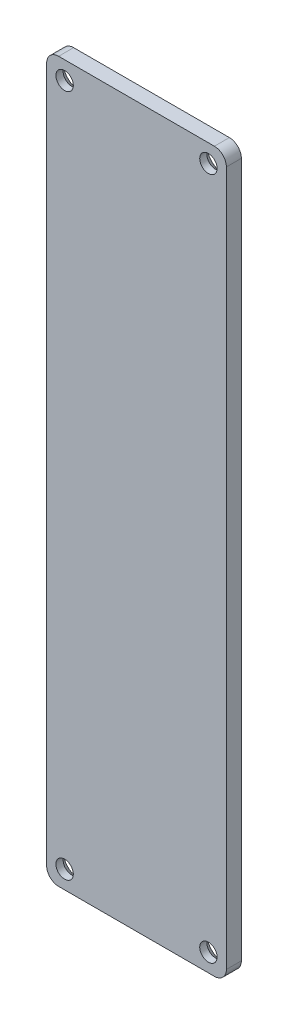
ISO-10303-21;
HEADER;
FILE_DESCRIPTION(('STEP AP214'),'2;1');
FILE_NAME('part.step','',(''),(''),'','','');
FILE_SCHEMA(('AUTOMOTIVE_DESIGN { 1 0 10303 214 1 1 1 1 }'));
ENDSEC;
DATA;
#1=APPLICATION_CONTEXT('core data for automotive mechanical design processes');
#2=APPLICATION_PROTOCOL_DEFINITION('international standard','automotive_design',2000,#1);
#3=PRODUCT_CONTEXT('',#1,'mechanical');
#4=PRODUCT('Part','Part','',(#3));
#5=PRODUCT_RELATED_PRODUCT_CATEGORY('part','',(#4));
#6=PRODUCT_DEFINITION_FORMATION('','',#4);
#7=PRODUCT_DEFINITION_CONTEXT('part definition',#1,'design');
#8=PRODUCT_DEFINITION('design','',#6,#7);
#9=PRODUCT_DEFINITION_SHAPE('','',#8);
#10=(LENGTH_UNIT() NAMED_UNIT(*) SI_UNIT(.MILLI.,.METRE.));
#11=(NAMED_UNIT(*) PLANE_ANGLE_UNIT() SI_UNIT($,.RADIAN.));
#12=(NAMED_UNIT(*) SI_UNIT($,.STERADIAN.) SOLID_ANGLE_UNIT());
#13=UNCERTAINTY_MEASURE_WITH_UNIT(LENGTH_MEASURE(1.E-05),#10,'distance_accuracy_value','');
#14=(GEOMETRIC_REPRESENTATION_CONTEXT(3) GLOBAL_UNCERTAINTY_ASSIGNED_CONTEXT((#13)) GLOBAL_UNIT_ASSIGNED_CONTEXT((#10,
#11,#12)) REPRESENTATION_CONTEXT('',''));
#15=CARTESIAN_POINT('',(0.,0.,0.));
#16=DIRECTION('',(0.,0.,1.));
#17=DIRECTION('',(1.,0.,0.));
#18=AXIS2_PLACEMENT_3D('',#15,#16,#17);
#19=CARTESIAN_POINT('',(-91.1225727439967,-25.5678939773836,2.5));
#20=DIRECTION('',(0.,0.,-1.));
#21=DIRECTION('',(-1.,0.,0.));
#22=AXIS2_PLACEMENT_3D('',#19,#20,#21);
#23=CYLINDRICAL_SURFACE('',#22,1.99999999999999);
#24=CARTESIAN_POINT('',(-91.1225727439967,-25.5678939773836,0.));
#25=DIRECTION('',(0.,0.,1.));
#26=DIRECTION('',(-1.,0.,0.));
#27=AXIS2_PLACEMENT_3D('',#24,#25,#26);
#28=CIRCLE('',#27,1.99999999999999);
#29=CARTESIAN_POINT('',(-93.1225727439967,-25.5678939773836,0.));
#30=VERTEX_POINT('',#29);
#31=CARTESIAN_POINT('',(-91.1225727439967,-27.5678939773836,0.));
#32=VERTEX_POINT('',#31);
#33=EDGE_CURVE('E135',#30,#32,#28,.T.);
#34=ORIENTED_EDGE('',*,*,#33,.T.);
#35=DIRECTION('',(0.,0.,-1.));
#36=VECTOR('',#35,1.);
#37=CARTESIAN_POINT('',(-91.1225727439967,-27.5678939773836,2.5));
#38=LINE('',#37,#36);
#39=CARTESIAN_POINT('',(-91.1225727439967,-27.5678939773836,2.5));
#40=VERTEX_POINT('',#39);
#41=EDGE_CURVE('E11',#40,#32,#38,.T.);
#42=ORIENTED_EDGE('',*,*,#41,.F.);
#43=CARTESIAN_POINT('',(-91.1225727439967,-25.5678939773836,2.5));
#44=DIRECTION('',(0.,0.,1.));
#45=DIRECTION('',(-1.,0.,0.));
#46=AXIS2_PLACEMENT_3D('',#43,#44,#45);
#47=CIRCLE('',#46,1.99999999999999);
#48=CARTESIAN_POINT('',(-93.1225727439967,-25.5678939773836,2.5));
#49=VERTEX_POINT('',#48);
#50=EDGE_CURVE('E150',#49,#40,#47,.T.);
#51=ORIENTED_EDGE('',*,*,#50,.F.);
#52=DIRECTION('',(0.,0.,-1.));
#53=VECTOR('',#52,1.);
#54=CARTESIAN_POINT('',(-93.1225727439967,-25.5678939773836,2.5));
#55=LINE('',#54,#53);
#56=EDGE_CURVE('E131',#49,#30,#55,.T.);
#57=ORIENTED_EDGE('',*,*,#56,.T.);
#58=EDGE_LOOP('',(#34,#42,#51,#57));
#59=FACE_BOUND('',#58,.T.);
#60=ADVANCED_FACE('F39',(#59),#23,.T.);
#61=CARTESIAN_POINT('',(-91.1225727439967,-27.5678939773836,2.5));
#62=DIRECTION('',(0.,1.,0.));
#63=DIRECTION('',(-1.,0.,0.));
#64=AXIS2_PLACEMENT_3D('',#61,#62,#63);
#65=PLANE('',#64);
#66=DIRECTION('',(1.,0.,0.));
#67=VECTOR('',#66,1.);
#68=CARTESIAN_POINT('',(-91.1225727439967,-27.5678939773836,0.));
#69=LINE('',#68,#67);
#70=CARTESIAN_POINT('',(-65.1225727439967,-27.5678939773836,0.));
#71=VERTEX_POINT('',#70);
#72=EDGE_CURVE('E138',#32,#71,#69,.T.);
#73=ORIENTED_EDGE('',*,*,#72,.T.);
#74=DIRECTION('',(0.,0.,-1.));
#75=VECTOR('',#74,1.);
#76=CARTESIAN_POINT('',(-65.1225727439967,-27.5678939773836,2.5));
#77=LINE('',#76,#75);
#78=CARTESIAN_POINT('',(-65.1225727439967,-27.5678939773836,2.5));
#79=VERTEX_POINT('',#78);
#80=EDGE_CURVE('E47',#79,#71,#77,.T.);
#81=ORIENTED_EDGE('',*,*,#80,.F.);
#82=DIRECTION('',(1.,0.,0.));
#83=VECTOR('',#82,1.);
#84=CARTESIAN_POINT('',(-91.1225727439967,-27.5678939773836,2.5));
#85=LINE('',#84,#83);
#86=EDGE_CURVE('E98',#40,#79,#85,.T.);
#87=ORIENTED_EDGE('',*,*,#86,.F.);
#88=ORIENTED_EDGE('',*,*,#41,.T.);
#89=EDGE_LOOP('',(#73,#81,#87,#88));
#90=FACE_BOUND('',#89,.T.);
#91=ADVANCED_FACE('F247',(#90),#65,.F.);
#92=CARTESIAN_POINT('',(-65.1225727439967,-25.5678939773836,2.5));
#93=DIRECTION('',(0.,0.,-1.));
#94=DIRECTION('',(-1.,0.,0.));
#95=AXIS2_PLACEMENT_3D('',#92,#93,#94);
#96=CYLINDRICAL_SURFACE('',#95,2.);
#97=CARTESIAN_POINT('',(-65.1225727439967,-25.5678939773836,0.));
#98=DIRECTION('',(0.,0.,1.));
#99=DIRECTION('',(1.,0.,0.));
#100=AXIS2_PLACEMENT_3D('',#97,#98,#99);
#101=CIRCLE('',#100,2.);
#102=CARTESIAN_POINT('',(-63.1225727439967,-25.5678939773836,0.));
#103=VERTEX_POINT('',#102);
#104=EDGE_CURVE('E141',#71,#103,#101,.T.);
#105=ORIENTED_EDGE('',*,*,#104,.T.);
#106=DIRECTION('',(0.,0.,-1.));
#107=VECTOR('',#106,1.);
#108=CARTESIAN_POINT('',(-63.1225727439967,-25.5678939773836,2.5));
#109=LINE('',#108,#107);
#110=CARTESIAN_POINT('',(-63.1225727439967,-25.5678939773836,2.5));
#111=VERTEX_POINT('',#110);
#112=EDGE_CURVE('E157',#111,#103,#109,.T.);
#113=ORIENTED_EDGE('',*,*,#112,.F.);
#114=CARTESIAN_POINT('',(-65.1225727439967,-25.5678939773836,2.5));
#115=DIRECTION('',(0.,0.,1.));
#116=DIRECTION('',(1.,0.,0.));
#117=AXIS2_PLACEMENT_3D('',#114,#115,#116);
#118=CIRCLE('',#117,2.);
#119=EDGE_CURVE('E165',#79,#111,#118,.T.);
#120=ORIENTED_EDGE('',*,*,#119,.F.);
#121=ORIENTED_EDGE('',*,*,#80,.T.);
#122=EDGE_LOOP('',(#105,#113,#120,#121));
#123=FACE_BOUND('',#122,.T.);
#124=ADVANCED_FACE('F163',(#123),#96,.T.);
#125=CARTESIAN_POINT('',(-63.1225727439967,90.4321060226164,2.5));
#126=DIRECTION('',(-1.,0.,0.));
#127=DIRECTION('',(0.,-1.,0.));
#128=AXIS2_PLACEMENT_3D('',#125,#126,#127);
#129=PLANE('',#128);
#130=DIRECTION('',(0.,1.,0.));
#131=VECTOR('',#130,1.);
#132=CARTESIAN_POINT('',(-63.1225727439967,90.4321060226164,0.));
#133=LINE('',#132,#131);
#134=CARTESIAN_POINT('',(-63.1225727439967,90.4321060226164,0.));
#135=VERTEX_POINT('',#134);
#136=EDGE_CURVE('E143',#103,#135,#133,.T.);
#137=ORIENTED_EDGE('',*,*,#136,.T.);
#138=DIRECTION('',(0.,0.,-1.));
#139=VECTOR('',#138,1.);
#140=CARTESIAN_POINT('',(-63.1225727439967,90.4321060226164,2.5));
#141=LINE('',#140,#139);
#142=CARTESIAN_POINT('',(-63.1225727439967,90.4321060226164,2.5));
#143=VERTEX_POINT('',#142);
#144=EDGE_CURVE('E154',#143,#135,#141,.T.);
#145=ORIENTED_EDGE('',*,*,#144,.F.);
#146=DIRECTION('',(0.,1.,0.));
#147=VECTOR('',#146,1.);
#148=CARTESIAN_POINT('',(-63.1225727439967,90.4321060226164,2.5));
#149=LINE('',#148,#147);
#150=EDGE_CURVE('E177',#111,#143,#149,.T.);
#151=ORIENTED_EDGE('',*,*,#150,.F.);
#152=ORIENTED_EDGE('',*,*,#112,.T.);
#153=EDGE_LOOP('',(#137,#145,#151,#152));
#154=FACE_BOUND('',#153,.T.);
#155=ADVANCED_FACE('F173',(#154),#129,.F.);
#156=CARTESIAN_POINT('',(-65.1225727439967,90.4321060226164,2.5));
#157=DIRECTION('',(0.,0.,-1.));
#158=DIRECTION('',(-1.,0.,0.));
#159=AXIS2_PLACEMENT_3D('',#156,#157,#158);
#160=CYLINDRICAL_SURFACE('',#159,2.);
#161=CARTESIAN_POINT('',(-65.1225727439967,90.4321060226164,0.));
#162=DIRECTION('',(0.,0.,1.));
#163=DIRECTION('',(-1.,0.,0.));
#164=AXIS2_PLACEMENT_3D('',#161,#162,#163);
#165=CIRCLE('',#164,2.);
#166=CARTESIAN_POINT('',(-65.1225727439967,92.4321060226164,0.));
#167=VERTEX_POINT('',#166);
#168=EDGE_CURVE('E145',#135,#167,#165,.T.);
#169=ORIENTED_EDGE('',*,*,#168,.T.);
#170=DIRECTION('',(0.,0.,-1.));
#171=VECTOR('',#170,1.);
#172=CARTESIAN_POINT('',(-65.1225727439967,92.4321060226164,2.5));
#173=LINE('',#172,#171);
#174=CARTESIAN_POINT('',(-65.1225727439967,92.4321060226164,2.5));
#175=VERTEX_POINT('',#174);
#176=EDGE_CURVE('E126',#175,#167,#173,.T.);
#177=ORIENTED_EDGE('',*,*,#176,.F.);
#178=CARTESIAN_POINT('',(-65.1225727439967,90.4321060226164,2.5));
#179=DIRECTION('',(0.,0.,1.));
#180=DIRECTION('',(-1.,0.,0.));
#181=AXIS2_PLACEMENT_3D('',#178,#179,#180);
#182=CIRCLE('',#181,2.);
#183=EDGE_CURVE('E117',#143,#175,#182,.T.);
#184=ORIENTED_EDGE('',*,*,#183,.F.);
#185=ORIENTED_EDGE('',*,*,#144,.T.);
#186=EDGE_LOOP('',(#169,#177,#184,#185));
#187=FACE_BOUND('',#186,.T.);
#188=ADVANCED_FACE('F176',(#187),#160,.T.);
#189=CARTESIAN_POINT('',(-91.1225727439967,92.4321060226164,2.5));
#190=DIRECTION('',(0.,-1.,0.));
#191=DIRECTION('',(0.,0.,-1.));
#192=AXIS2_PLACEMENT_3D('',#189,#190,#191);
#193=PLANE('',#192);
#194=DIRECTION('',(-1.,0.,0.));
#195=VECTOR('',#194,1.);
#196=CARTESIAN_POINT('',(-91.1225727439967,92.4321060226164,0.));
#197=LINE('',#196,#195);
#198=CARTESIAN_POINT('',(-91.1225727439967,92.4321060226164,0.));
#199=VERTEX_POINT('',#198);
#200=EDGE_CURVE('E125',#167,#199,#197,.T.);
#201=ORIENTED_EDGE('',*,*,#200,.T.);
#202=DIRECTION('',(0.,0.,-1.));
#203=VECTOR('',#202,1.);
#204=CARTESIAN_POINT('',(-91.1225727439967,92.4321060226164,2.5));
#205=LINE('',#204,#203);
#206=CARTESIAN_POINT('',(-91.1225727439967,92.4321060226164,2.5));
#207=VERTEX_POINT('',#206);
#208=EDGE_CURVE('E122',#207,#199,#205,.T.);
#209=ORIENTED_EDGE('',*,*,#208,.F.);
#210=DIRECTION('',(-1.,0.,0.));
#211=VECTOR('',#210,1.);
#212=CARTESIAN_POINT('',(-91.1225727439967,92.4321060226164,2.5));
#213=LINE('',#212,#211);
#214=EDGE_CURVE('E111',#175,#207,#213,.T.);
#215=ORIENTED_EDGE('',*,*,#214,.F.);
#216=ORIENTED_EDGE('',*,*,#176,.T.);
#217=EDGE_LOOP('',(#201,#209,#215,#216));
#218=FACE_BOUND('',#217,.T.);
#219=ADVANCED_FACE('F123',(#218),#193,.F.);
#220=CARTESIAN_POINT('',(-91.1225727439967,90.4321060226164,2.5));
#221=DIRECTION('',(0.,0.,-1.));
#222=DIRECTION('',(-1.,0.,0.));
#223=AXIS2_PLACEMENT_3D('',#220,#221,#222);
#224=CYLINDRICAL_SURFACE('',#223,1.99999999999999);
#225=CARTESIAN_POINT('',(-91.1225727439967,90.4321060226164,0.));
#226=DIRECTION('',(0.,0.,1.));
#227=DIRECTION('',(-1.,0.,0.));
#228=AXIS2_PLACEMENT_3D('',#225,#226,#227);
#229=CIRCLE('',#228,1.99999999999999);
#230=CARTESIAN_POINT('',(-93.1225727439967,90.4321060226164,0.));
#231=VERTEX_POINT('',#230);
#232=EDGE_CURVE('E84',#199,#231,#229,.T.);
#233=ORIENTED_EDGE('',*,*,#232,.T.);
#234=DIRECTION('',(0.,0.,-1.));
#235=VECTOR('',#234,1.);
#236=CARTESIAN_POINT('',(-93.1225727439967,90.4321060226164,2.5));
#237=LINE('',#236,#235);
#238=CARTESIAN_POINT('',(-93.1225727439967,90.4321060226164,2.5));
#239=VERTEX_POINT('',#238);
#240=EDGE_CURVE('E127',#239,#231,#237,.T.);
#241=ORIENTED_EDGE('',*,*,#240,.F.);
#242=CARTESIAN_POINT('',(-91.1225727439967,90.4321060226164,2.5));
#243=DIRECTION('',(0.,0.,1.));
#244=DIRECTION('',(-1.,0.,0.));
#245=AXIS2_PLACEMENT_3D('',#242,#243,#244);
#246=CIRCLE('',#245,1.99999999999999);
#247=EDGE_CURVE('E115',#207,#239,#246,.T.);
#248=ORIENTED_EDGE('',*,*,#247,.F.);
#249=ORIENTED_EDGE('',*,*,#208,.T.);
#250=EDGE_LOOP('',(#233,#241,#248,#249));
#251=FACE_BOUND('',#250,.T.);
#252=ADVANCED_FACE('F129',(#251),#224,.T.);
#253=CARTESIAN_POINT('',(-93.1225727439967,-25.5678939773836,2.5));
#254=DIRECTION('',(1.,0.,0.));
#255=DIRECTION('',(0.,0.,-1.));
#256=AXIS2_PLACEMENT_3D('',#253,#254,#255);
#257=PLANE('',#256);
#258=DIRECTION('',(0.,-1.,0.));
#259=VECTOR('',#258,1.);
#260=CARTESIAN_POINT('',(-93.1225727439967,-25.5678939773836,0.));
#261=LINE('',#260,#259);
#262=EDGE_CURVE('E90',#231,#30,#261,.T.);
#263=ORIENTED_EDGE('',*,*,#262,.T.);
#264=ORIENTED_EDGE('',*,*,#56,.F.);
#265=DIRECTION('',(0.,-1.,0.));
#266=VECTOR('',#265,1.);
#267=CARTESIAN_POINT('',(-93.1225727439967,-25.5678939773836,2.5));
#268=LINE('',#267,#266);
#269=EDGE_CURVE('E55',#239,#49,#268,.T.);
#270=ORIENTED_EDGE('',*,*,#269,.F.);
#271=ORIENTED_EDGE('',*,*,#240,.T.);
#272=EDGE_LOOP('',(#263,#264,#270,#271));
#273=FACE_BOUND('',#272,.T.);
#274=ADVANCED_FACE('F254',(#273),#257,.F.);
#275=CARTESIAN_POINT('',(-91.1225727439967,-25.5678939773836,2.5));
#276=DIRECTION('',(0.,0.,-1.));
#277=DIRECTION('',(-1.,0.,0.));
#278=AXIS2_PLACEMENT_3D('',#275,#276,#277);
#279=PLANE('',#278);
#280=CARTESIAN_POINT('',(-66.1225727439967,89.4321060226164,2.5));
#281=DIRECTION('',(0.,0.,-1.));
#282=DIRECTION('',(-1.,0.,0.));
#283=AXIS2_PLACEMENT_3D('',#280,#281,#282);
#284=CIRCLE('',#283,1.44999999999999);
#285=CARTESIAN_POINT('',(-67.5725727439967,89.4321060226164,2.5));
#286=VERTEX_POINT('',#285);
#287=EDGE_CURVE('E209',#286,#286,#284,.T.);
#288=ORIENTED_EDGE('',*,*,#287,.T.);
#289=EDGE_LOOP('',(#288));
#290=FACE_BOUND('',#289,.T.);
#291=CARTESIAN_POINT('',(-90.1225727439967,89.4321060226164,2.5));
#292=DIRECTION('',(0.,0.,-1.));
#293=DIRECTION('',(-1.,0.,0.));
#294=AXIS2_PLACEMENT_3D('',#291,#292,#293);
#295=CIRCLE('',#294,1.44999999999999);
#296=CARTESIAN_POINT('',(-91.5725727439967,89.4321060226164,2.5));
#297=VERTEX_POINT('',#296);
#298=EDGE_CURVE('E200',#297,#297,#295,.T.);
#299=ORIENTED_EDGE('',*,*,#298,.T.);
#300=EDGE_LOOP('',(#299));
#301=FACE_BOUND('',#300,.T.);
#302=CARTESIAN_POINT('',(-66.1225727439967,-24.5678939773836,2.5));
#303=DIRECTION('',(0.,0.,-1.));
#304=DIRECTION('',(-1.,0.,0.));
#305=AXIS2_PLACEMENT_3D('',#302,#303,#304);
#306=CIRCLE('',#305,1.44999999999999);
#307=CARTESIAN_POINT('',(-67.5725727439967,-24.5678939773836,2.5));
#308=VERTEX_POINT('',#307);
#309=EDGE_CURVE('E191',#308,#308,#306,.T.);
#310=ORIENTED_EDGE('',*,*,#309,.T.);
#311=EDGE_LOOP('',(#310));
#312=FACE_BOUND('',#311,.T.);
#313=CARTESIAN_POINT('',(-90.1225727439967,-24.5678939773836,2.5));
#314=DIRECTION('',(0.,0.,-1.));
#315=DIRECTION('',(-1.,0.,0.));
#316=AXIS2_PLACEMENT_3D('',#313,#314,#315);
#317=CIRCLE('',#316,1.44999999999999);
#318=CARTESIAN_POINT('',(-91.5725727439967,-24.5678939773836,2.5));
#319=VERTEX_POINT('',#318);
#320=EDGE_CURVE('E139',#319,#319,#317,.T.);
#321=ORIENTED_EDGE('',*,*,#320,.T.);
#322=EDGE_LOOP('',(#321));
#323=FACE_BOUND('',#322,.T.);
#324=ORIENTED_EDGE('',*,*,#50,.T.);
#325=ORIENTED_EDGE('',*,*,#86,.T.);
#326=ORIENTED_EDGE('',*,*,#119,.T.);
#327=ORIENTED_EDGE('',*,*,#150,.T.);
#328=ORIENTED_EDGE('',*,*,#183,.T.);
#329=ORIENTED_EDGE('',*,*,#214,.T.);
#330=ORIENTED_EDGE('',*,*,#247,.T.);
#331=ORIENTED_EDGE('',*,*,#269,.T.);
#332=EDGE_LOOP('',(#324,#325,#326,#327,#328,#329,#330,#331));
#333=FACE_BOUND('',#332,.T.);
#334=ADVANCED_FACE('F113',(#290,#301,#312,#323,#333),#279,.F.);
#335=CARTESIAN_POINT('',(-91.1225727439967,-25.5678939773836,0.));
#336=DIRECTION('',(0.,0.,-1.));
#337=DIRECTION('',(-1.,0.,0.));
#338=AXIS2_PLACEMENT_3D('',#335,#336,#337);
#339=PLANE('',#338);
#340=CARTESIAN_POINT('',(-66.1225727439967,89.4321060226164,0.));
#341=DIRECTION('',(0.,0.,-1.));
#342=DIRECTION('',(-1.,0.,0.));
#343=AXIS2_PLACEMENT_3D('',#340,#341,#342);
#344=CIRCLE('',#343,2.75);
#345=CARTESIAN_POINT('',(-68.8725727439967,89.4321060226164,0.));
#346=VERTEX_POINT('',#345);
#347=EDGE_CURVE('E215',#346,#346,#344,.T.);
#348=ORIENTED_EDGE('',*,*,#347,.F.);
#349=EDGE_LOOP('',(#348));
#350=FACE_BOUND('',#349,.T.);
#351=CARTESIAN_POINT('',(-90.1225727439967,89.4321060226164,0.));
#352=DIRECTION('',(0.,0.,-1.));
#353=DIRECTION('',(-1.,0.,0.));
#354=AXIS2_PLACEMENT_3D('',#351,#352,#353);
#355=CIRCLE('',#354,2.75);
#356=CARTESIAN_POINT('',(-92.8725727439967,89.4321060226164,0.));
#357=VERTEX_POINT('',#356);
#358=EDGE_CURVE('E206',#357,#357,#355,.T.);
#359=ORIENTED_EDGE('',*,*,#358,.F.);
#360=EDGE_LOOP('',(#359));
#361=FACE_BOUND('',#360,.T.);
#362=CARTESIAN_POINT('',(-66.1225727439967,-24.5678939773836,0.));
#363=DIRECTION('',(0.,0.,-1.));
#364=DIRECTION('',(-1.,0.,0.));
#365=AXIS2_PLACEMENT_3D('',#362,#363,#364);
#366=CIRCLE('',#365,2.75);
#367=CARTESIAN_POINT('',(-68.8725727439967,-24.5678939773836,0.));
#368=VERTEX_POINT('',#367);
#369=EDGE_CURVE('E197',#368,#368,#366,.T.);
#370=ORIENTED_EDGE('',*,*,#369,.F.);
#371=EDGE_LOOP('',(#370));
#372=FACE_BOUND('',#371,.T.);
#373=CARTESIAN_POINT('',(-90.1225727439967,-24.5678939773836,0.));
#374=DIRECTION('',(0.,0.,-1.));
#375=DIRECTION('',(-1.,0.,0.));
#376=AXIS2_PLACEMENT_3D('',#373,#374,#375);
#377=CIRCLE('',#376,2.75);
#378=CARTESIAN_POINT('',(-92.8725727439967,-24.5678939773836,0.));
#379=VERTEX_POINT('',#378);
#380=EDGE_CURVE('E188',#379,#379,#377,.T.);
#381=ORIENTED_EDGE('',*,*,#380,.F.);
#382=EDGE_LOOP('',(#381));
#383=FACE_BOUND('',#382,.T.);
#384=ORIENTED_EDGE('',*,*,#33,.F.);
#385=ORIENTED_EDGE('',*,*,#262,.F.);
#386=ORIENTED_EDGE('',*,*,#232,.F.);
#387=ORIENTED_EDGE('',*,*,#200,.F.);
#388=ORIENTED_EDGE('',*,*,#168,.F.);
#389=ORIENTED_EDGE('',*,*,#136,.F.);
#390=ORIENTED_EDGE('',*,*,#104,.F.);
#391=ORIENTED_EDGE('',*,*,#72,.F.);
#392=EDGE_LOOP('',(#384,#385,#386,#387,#388,#389,#390,#391));
#393=FACE_BOUND('',#392,.T.);
#394=ADVANCED_FACE('F169',(#350,#361,#372,#383,#393),#339,.T.);
#395=CARTESIAN_POINT('',(-90.1225727439967,-24.5678939773836,0.));
#396=DIRECTION('',(0.,0.,-1.));
#397=DIRECTION('',(-1.,0.,0.));
#398=AXIS2_PLACEMENT_3D('',#395,#396,#397);
#399=CYLINDRICAL_SURFACE('',#398,1.44999999999999);
#400=ORIENTED_EDGE('',*,*,#320,.F.);
#401=EDGE_LOOP('',(#400));
#402=FACE_BOUND('',#401,.T.);
#403=CARTESIAN_POINT('',(-90.1225727439967,-24.5678939773836,1.30000000000001));
#404=DIRECTION('',(0.,0.,-1.));
#405=DIRECTION('',(-1.,0.,0.));
#406=AXIS2_PLACEMENT_3D('',#403,#404,#405);
#407=CIRCLE('',#406,1.44999999999999);
#408=CARTESIAN_POINT('',(-91.5725727439967,-24.5678939773836,1.30000000000001));
#409=VERTEX_POINT('',#408);
#410=EDGE_CURVE('E185',#409,#409,#407,.T.);
#411=ORIENTED_EDGE('',*,*,#410,.T.);
#412=EDGE_LOOP('',(#411));
#413=FACE_BOUND('',#412,.T.);
#414=ADVANCED_FACE('F223',(#402,#413),#399,.F.);
#415=CARTESIAN_POINT('',(-90.1225727439967,-24.5678939773836,0.));
#416=DIRECTION('',(0.,0.,-1.));
#417=DIRECTION('',(-1.,0.,0.));
#418=AXIS2_PLACEMENT_3D('',#415,#416,#417);
#419=CONICAL_SURFACE('',#418,2.75,0.785398163397448);
#420=ORIENTED_EDGE('',*,*,#410,.F.);
#421=EDGE_LOOP('',(#420));
#422=FACE_BOUND('',#421,.T.);
#423=ORIENTED_EDGE('',*,*,#380,.T.);
#424=EDGE_LOOP('',(#423));
#425=FACE_BOUND('',#424,.T.);
#426=ADVANCED_FACE('F231',(#422,#425),#419,.F.);
#427=CARTESIAN_POINT('',(-66.1225727439967,-24.5678939773836,0.));
#428=DIRECTION('',(0.,0.,-1.));
#429=DIRECTION('',(-1.,0.,0.));
#430=AXIS2_PLACEMENT_3D('',#427,#428,#429);
#431=CYLINDRICAL_SURFACE('',#430,1.44999999999999);
#432=ORIENTED_EDGE('',*,*,#309,.F.);
#433=EDGE_LOOP('',(#432));
#434=FACE_BOUND('',#433,.T.);
#435=CARTESIAN_POINT('',(-66.1225727439967,-24.5678939773836,1.30000000000001));
#436=DIRECTION('',(0.,0.,-1.));
#437=DIRECTION('',(-1.,0.,0.));
#438=AXIS2_PLACEMENT_3D('',#435,#436,#437);
#439=CIRCLE('',#438,1.44999999999999);
#440=CARTESIAN_POINT('',(-67.5725727439967,-24.5678939773836,1.30000000000001));
#441=VERTEX_POINT('',#440);
#442=EDGE_CURVE('E194',#441,#441,#439,.T.);
#443=ORIENTED_EDGE('',*,*,#442,.T.);
#444=EDGE_LOOP('',(#443));
#445=FACE_BOUND('',#444,.T.);
#446=ADVANCED_FACE('F233',(#434,#445),#431,.F.);
#447=CARTESIAN_POINT('',(-66.1225727439967,-24.5678939773836,0.));
#448=DIRECTION('',(0.,0.,-1.));
#449=DIRECTION('',(-1.,0.,0.));
#450=AXIS2_PLACEMENT_3D('',#447,#448,#449);
#451=CONICAL_SURFACE('',#450,2.75,0.785398163397448);
#452=ORIENTED_EDGE('',*,*,#442,.F.);
#453=EDGE_LOOP('',(#452));
#454=FACE_BOUND('',#453,.T.);
#455=ORIENTED_EDGE('',*,*,#369,.T.);
#456=EDGE_LOOP('',(#455));
#457=FACE_BOUND('',#456,.T.);
#458=ADVANCED_FACE('F240',(#454,#457),#451,.F.);
#459=CARTESIAN_POINT('',(-90.1225727439967,89.4321060226164,0.));
#460=DIRECTION('',(0.,0.,-1.));
#461=DIRECTION('',(-1.,0.,0.));
#462=AXIS2_PLACEMENT_3D('',#459,#460,#461);
#463=CYLINDRICAL_SURFACE('',#462,1.44999999999999);
#464=ORIENTED_EDGE('',*,*,#298,.F.);
#465=EDGE_LOOP('',(#464));
#466=FACE_BOUND('',#465,.T.);
#467=CARTESIAN_POINT('',(-90.1225727439967,89.4321060226164,1.30000000000001));
#468=DIRECTION('',(0.,0.,-1.));
#469=DIRECTION('',(-1.,0.,0.));
#470=AXIS2_PLACEMENT_3D('',#467,#468,#469);
#471=CIRCLE('',#470,1.44999999999999);
#472=CARTESIAN_POINT('',(-91.5725727439967,89.4321060226164,1.30000000000001));
#473=VERTEX_POINT('',#472);
#474=EDGE_CURVE('E203',#473,#473,#471,.T.);
#475=ORIENTED_EDGE('',*,*,#474,.T.);
#476=EDGE_LOOP('',(#475));
#477=FACE_BOUND('',#476,.T.);
#478=ADVANCED_FACE('F338',(#466,#477),#463,.F.);
#479=CARTESIAN_POINT('',(-90.1225727439967,89.4321060226164,0.));
#480=DIRECTION('',(0.,0.,-1.));
#481=DIRECTION('',(-1.,0.,0.));
#482=AXIS2_PLACEMENT_3D('',#479,#480,#481);
#483=CONICAL_SURFACE('',#482,2.75,0.785398163397448);
#484=ORIENTED_EDGE('',*,*,#474,.F.);
#485=EDGE_LOOP('',(#484));
#486=FACE_BOUND('',#485,.T.);
#487=ORIENTED_EDGE('',*,*,#358,.T.);
#488=EDGE_LOOP('',(#487));
#489=FACE_BOUND('',#488,.T.);
#490=ADVANCED_FACE('F348',(#486,#489),#483,.F.);
#491=CARTESIAN_POINT('',(-66.1225727439967,89.4321060226164,0.));
#492=DIRECTION('',(0.,0.,-1.));
#493=DIRECTION('',(-1.,0.,0.));
#494=AXIS2_PLACEMENT_3D('',#491,#492,#493);
#495=CYLINDRICAL_SURFACE('',#494,1.44999999999999);
#496=ORIENTED_EDGE('',*,*,#287,.F.);
#497=EDGE_LOOP('',(#496));
#498=FACE_BOUND('',#497,.T.);
#499=CARTESIAN_POINT('',(-66.1225727439967,89.4321060226164,1.30000000000001));
#500=DIRECTION('',(0.,0.,-1.));
#501=DIRECTION('',(-1.,0.,0.));
#502=AXIS2_PLACEMENT_3D('',#499,#500,#501);
#503=CIRCLE('',#502,1.44999999999999);
#504=CARTESIAN_POINT('',(-67.5725727439967,89.4321060226164,1.30000000000001));
#505=VERTEX_POINT('',#504);
#506=EDGE_CURVE('E212',#505,#505,#503,.T.);
#507=ORIENTED_EDGE('',*,*,#506,.T.);
#508=EDGE_LOOP('',(#507));
#509=FACE_BOUND('',#508,.T.);
#510=ADVANCED_FACE('F358',(#498,#509),#495,.F.);
#511=CARTESIAN_POINT('',(-66.1225727439967,89.4321060226164,0.));
#512=DIRECTION('',(0.,0.,-1.));
#513=DIRECTION('',(-1.,0.,0.));
#514=AXIS2_PLACEMENT_3D('',#511,#512,#513);
#515=CONICAL_SURFACE('',#514,2.75,0.785398163397448);
#516=ORIENTED_EDGE('',*,*,#506,.F.);
#517=EDGE_LOOP('',(#516));
#518=FACE_BOUND('',#517,.T.);
#519=ORIENTED_EDGE('',*,*,#347,.T.);
#520=EDGE_LOOP('',(#519));
#521=FACE_BOUND('',#520,.T.);
#522=ADVANCED_FACE('F219',(#518,#521),#515,.F.);
#523=CLOSED_SHELL('',(#60,#91,#124,#155,#188,#219,#252,#274,#334,#394,#414,#426,#446,#458,#478,
#490,#510,#522));
#524=MANIFOLD_SOLID_BREP('B2',#523);
#525=ADVANCED_BREP_SHAPE_REPRESENTATION('',(#18,#524),#14);
#526=SHAPE_DEFINITION_REPRESENTATION(#9,#525);
ENDSEC;
END-ISO-10303-21;
